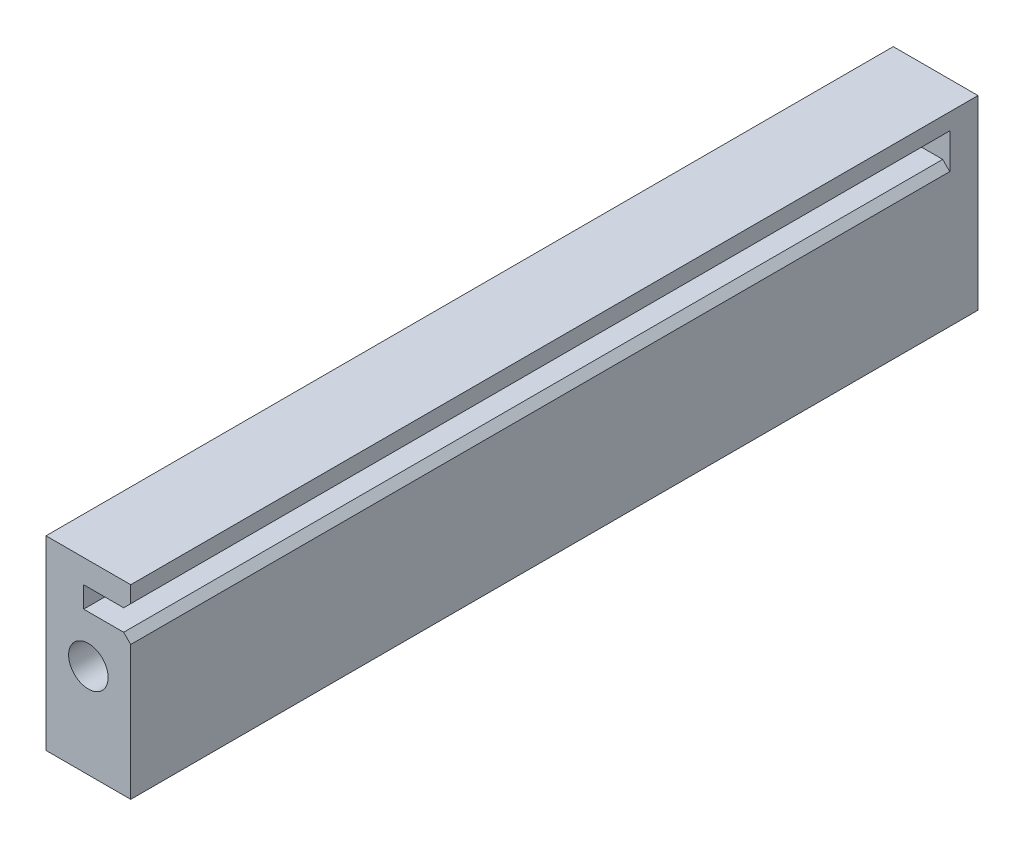
ISO-10303-21;
HEADER;
FILE_DESCRIPTION(('STEP AP214'),'2;1');
FILE_NAME('part.step','',(''),(''),'','','');
FILE_SCHEMA(('AUTOMOTIVE_DESIGN { 1 0 10303 214 1 1 1 1 }'));
ENDSEC;
DATA;
#1=APPLICATION_CONTEXT('core data for automotive mechanical design processes');
#2=APPLICATION_PROTOCOL_DEFINITION('international standard','automotive_design',2000,#1);
#3=PRODUCT_CONTEXT('',#1,'mechanical');
#4=PRODUCT('Part','Part','',(#3));
#5=PRODUCT_RELATED_PRODUCT_CATEGORY('part','',(#4));
#6=PRODUCT_DEFINITION_FORMATION('','',#4);
#7=PRODUCT_DEFINITION_CONTEXT('part definition',#1,'design');
#8=PRODUCT_DEFINITION('design','',#6,#7);
#9=PRODUCT_DEFINITION_SHAPE('','',#8);
#10=(LENGTH_UNIT() NAMED_UNIT(*) SI_UNIT(.MILLI.,.METRE.));
#11=(NAMED_UNIT(*) PLANE_ANGLE_UNIT() SI_UNIT($,.RADIAN.));
#12=(NAMED_UNIT(*) SI_UNIT($,.STERADIAN.) SOLID_ANGLE_UNIT());
#13=UNCERTAINTY_MEASURE_WITH_UNIT(LENGTH_MEASURE(1.E-05),#10,'distance_accuracy_value','');
#14=(GEOMETRIC_REPRESENTATION_CONTEXT(3) GLOBAL_UNCERTAINTY_ASSIGNED_CONTEXT((#13)) GLOBAL_UNIT_ASSIGNED_CONTEXT((#10,
#11,#12)) REPRESENTATION_CONTEXT('',''));
#15=CARTESIAN_POINT('',(0.,0.,0.));
#16=DIRECTION('',(0.,0.,1.));
#17=DIRECTION('',(1.,0.,0.));
#18=AXIS2_PLACEMENT_3D('',#15,#16,#17);
#19=CARTESIAN_POINT('',(0.,7.5,90.));
#20=DIRECTION('',(0.,1.,0.));
#21=DIRECTION('',(0.,0.,1.));
#22=AXIS2_PLACEMENT_3D('',#19,#20,#21);
#23=PLANE('',#22);
#24=DIRECTION('',(1.,0.,0.));
#25=VECTOR('',#24,1.);
#26=CARTESIAN_POINT('',(0.,7.5,90.));
#27=LINE('',#26,#25);
#28=CARTESIAN_POINT('',(-0.499999999999999,7.5,90.));
#29=VERTEX_POINT('',#28);
#30=CARTESIAN_POINT('',(3.75,7.5,90.));
#31=VERTEX_POINT('',#30);
#32=EDGE_CURVE('E171',#29,#31,#27,.T.);
#33=ORIENTED_EDGE('',*,*,#32,.T.);
#34=DIRECTION('',(0.,0.,-1.));
#35=VECTOR('',#34,1.);
#36=CARTESIAN_POINT('',(3.75,7.5,3.));
#37=LINE('',#36,#35);
#38=CARTESIAN_POINT('',(3.75,7.5,3.));
#39=VERTEX_POINT('',#38);
#40=EDGE_CURVE('E121',#31,#39,#37,.T.);
#41=ORIENTED_EDGE('',*,*,#40,.T.);
#42=DIRECTION('',(-1.,0.,0.));
#43=VECTOR('',#42,1.);
#44=CARTESIAN_POINT('',(4.5,7.5,3.));
#45=LINE('',#44,#43);
#46=CARTESIAN_POINT('',(-0.499999999999999,7.5,3.));
#47=VERTEX_POINT('',#46);
#48=EDGE_CURVE('E114',#39,#47,#45,.T.);
#49=ORIENTED_EDGE('',*,*,#48,.T.);
#50=DIRECTION('',(0.,0.,-1.));
#51=VECTOR('',#50,1.);
#52=CARTESIAN_POINT('',(-0.499999999999999,7.5,90.));
#53=LINE('',#52,#51);
#54=EDGE_CURVE('E118',#29,#47,#53,.T.);
#55=ORIENTED_EDGE('',*,*,#54,.F.);
#56=EDGE_LOOP('',(#33,#41,#49,#55));
#57=FACE_BOUND('',#56,.T.);
#58=ADVANCED_FACE('F38',(#57),#23,.T.);
#59=CARTESIAN_POINT('',(-0.499999999999999,0.,90.));
#60=DIRECTION('',(-1.,0.,0.));
#61=DIRECTION('',(0.,0.,1.));
#62=AXIS2_PLACEMENT_3D('',#59,#60,#61);
#63=PLANE('',#62);
#64=DIRECTION('',(0.,1.,0.));
#65=VECTOR('',#64,1.);
#66=CARTESIAN_POINT('',(-0.499999999999999,9.75,3.));
#67=LINE('',#66,#65);
#68=CARTESIAN_POINT('',(-0.499999999999999,9.75,3.));
#69=VERTEX_POINT('',#68);
#70=EDGE_CURVE('E123',#47,#69,#67,.T.);
#71=ORIENTED_EDGE('',*,*,#70,.T.);
#72=DIRECTION('',(0.,0.,-1.));
#73=VECTOR('',#72,1.);
#74=CARTESIAN_POINT('',(-0.499999999999999,9.75,90.));
#75=LINE('',#74,#73);
#76=CARTESIAN_POINT('',(-0.499999999999999,9.75,90.));
#77=VERTEX_POINT('',#76);
#78=EDGE_CURVE('E138',#77,#69,#75,.T.);
#79=ORIENTED_EDGE('',*,*,#78,.F.);
#80=DIRECTION('',(0.,1.,0.));
#81=VECTOR('',#80,1.);
#82=CARTESIAN_POINT('',(-0.499999999999999,0.,90.));
#83=LINE('',#82,#81);
#84=EDGE_CURVE('E135',#29,#77,#83,.T.);
#85=ORIENTED_EDGE('',*,*,#84,.F.);
#86=ORIENTED_EDGE('',*,*,#54,.T.);
#87=EDGE_LOOP('',(#71,#79,#85,#86));
#88=FACE_BOUND('',#87,.T.);
#89=ADVANCED_FACE('F133',(#88),#63,.F.);
#90=CARTESIAN_POINT('',(0.,9.75,90.));
#91=DIRECTION('',(0.,-1.,0.));
#92=DIRECTION('',(1.,0.,0.));
#93=AXIS2_PLACEMENT_3D('',#90,#91,#92);
#94=PLANE('',#93);
#95=DIRECTION('',(1.,0.,0.));
#96=VECTOR('',#95,1.);
#97=CARTESIAN_POINT('',(4.5,9.75,3.));
#98=LINE('',#97,#96);
#99=CARTESIAN_POINT('',(3.74999999999999,9.75,3.));
#100=VERTEX_POINT('',#99);
#101=EDGE_CURVE('E128',#69,#100,#98,.T.);
#102=ORIENTED_EDGE('',*,*,#101,.T.);
#103=DIRECTION('',(0.,0.,1.));
#104=VECTOR('',#103,1.);
#105=CARTESIAN_POINT('',(3.74999999999999,9.75,90.));
#106=LINE('',#105,#104);
#107=CARTESIAN_POINT('',(3.74999999999999,9.75,90.));
#108=VERTEX_POINT('',#107);
#109=EDGE_CURVE('E59',#100,#108,#106,.T.);
#110=ORIENTED_EDGE('',*,*,#109,.T.);
#111=DIRECTION('',(-1.,0.,0.));
#112=VECTOR('',#111,1.);
#113=CARTESIAN_POINT('',(0.,9.75,90.));
#114=LINE('',#113,#112);
#115=EDGE_CURVE('E179',#108,#77,#114,.T.);
#116=ORIENTED_EDGE('',*,*,#115,.T.);
#117=ORIENTED_EDGE('',*,*,#78,.T.);
#118=EDGE_LOOP('',(#102,#110,#116,#117));
#119=FACE_BOUND('',#118,.T.);
#120=ADVANCED_FACE('F233',(#119),#94,.T.);
#121=CARTESIAN_POINT('',(0.,-7.5,90.));
#122=DIRECTION('',(0.,1.,0.));
#123=DIRECTION('',(0.,0.,1.));
#124=AXIS2_PLACEMENT_3D('',#121,#122,#123);
#125=PLANE('',#124);
#126=CARTESIAN_POINT('',(0.,-7.5,22.5));
#127=DIRECTION('',(0.,-1.,0.));
#128=DIRECTION('',(0.,0.,-1.));
#129=AXIS2_PLACEMENT_3D('',#126,#127,#128);
#130=CIRCLE('',#129,2.1);
#131=CARTESIAN_POINT('',(0.,-7.5,20.4));
#132=VERTEX_POINT('',#131);
#133=EDGE_CURVE('E253',#132,#132,#130,.T.);
#134=ORIENTED_EDGE('',*,*,#133,.F.);
#135=EDGE_LOOP('',(#134));
#136=FACE_BOUND('',#135,.T.);
#137=CARTESIAN_POINT('',(0.,-7.5,67.5));
#138=DIRECTION('',(0.,-1.,0.));
#139=DIRECTION('',(0.,0.,-1.));
#140=AXIS2_PLACEMENT_3D('',#137,#138,#139);
#141=CIRCLE('',#140,2.1);
#142=CARTESIAN_POINT('',(0.,-7.5,65.4));
#143=VERTEX_POINT('',#142);
#144=EDGE_CURVE('E257',#143,#143,#141,.T.);
#145=ORIENTED_EDGE('',*,*,#144,.F.);
#146=EDGE_LOOP('',(#145));
#147=FACE_BOUND('',#146,.T.);
#148=CARTESIAN_POINT('',(0.,-7.5,45.));
#149=DIRECTION('',(0.,-1.,0.));
#150=DIRECTION('',(0.,0.,-1.));
#151=AXIS2_PLACEMENT_3D('',#148,#149,#150);
#152=CIRCLE('',#151,2.1);
#153=CARTESIAN_POINT('',(0.,-7.5,42.9));
#154=VERTEX_POINT('',#153);
#155=EDGE_CURVE('E261',#154,#154,#152,.T.);
#156=ORIENTED_EDGE('',*,*,#155,.F.);
#157=EDGE_LOOP('',(#156));
#158=FACE_BOUND('',#157,.T.);
#159=DIRECTION('',(1.,0.,0.));
#160=VECTOR('',#159,1.);
#161=CARTESIAN_POINT('',(0.,-7.5,0.));
#162=LINE('',#161,#160);
#163=CARTESIAN_POINT('',(-4.5,-7.5,0.));
#164=VERTEX_POINT('',#163);
#165=CARTESIAN_POINT('',(4.5,-7.5,0.));
#166=VERTEX_POINT('',#165);
#167=EDGE_CURVE('E190',#164,#166,#162,.T.);
#168=ORIENTED_EDGE('',*,*,#167,.T.);
#169=DIRECTION('',(0.,0.,-1.));
#170=VECTOR('',#169,1.);
#171=CARTESIAN_POINT('',(4.5,-7.5,90.));
#172=LINE('',#171,#170);
#173=CARTESIAN_POINT('',(4.5,-7.5,90.));
#174=VERTEX_POINT('',#173);
#175=EDGE_CURVE('E137',#174,#166,#172,.T.);
#176=ORIENTED_EDGE('',*,*,#175,.F.);
#177=DIRECTION('',(1.,0.,0.));
#178=VECTOR('',#177,1.);
#179=CARTESIAN_POINT('',(0.,-7.5,90.));
#180=LINE('',#179,#178);
#181=CARTESIAN_POINT('',(-4.5,-7.5,90.));
#182=VERTEX_POINT('',#181);
#183=EDGE_CURVE('E169',#182,#174,#180,.T.);
#184=ORIENTED_EDGE('',*,*,#183,.F.);
#185=DIRECTION('',(0.,0.,-1.));
#186=VECTOR('',#185,1.);
#187=CARTESIAN_POINT('',(-4.5,-7.5,90.));
#188=LINE('',#187,#186);
#189=EDGE_CURVE('E189',#182,#164,#188,.T.);
#190=ORIENTED_EDGE('',*,*,#189,.T.);
#191=EDGE_LOOP('',(#168,#176,#184,#190));
#192=FACE_BOUND('',#191,.T.);
#193=ADVANCED_FACE('F237',(#136,#147,#158,#192),#125,.F.);
#194=CARTESIAN_POINT('',(4.5,0.,90.));
#195=DIRECTION('',(-1.,0.,0.));
#196=DIRECTION('',(0.,0.,1.));
#197=AXIS2_PLACEMENT_3D('',#194,#195,#196);
#198=PLANE('',#197);
#199=DIRECTION('',(0.,-1.,0.));
#200=VECTOR('',#199,1.);
#201=CARTESIAN_POINT('',(4.5,9.75,3.));
#202=LINE('',#201,#200);
#203=CARTESIAN_POINT('',(4.5,10.5,3.));
#204=VERTEX_POINT('',#203);
#205=CARTESIAN_POINT('',(4.5,6.74999999999998,3.));
#206=VERTEX_POINT('',#205);
#207=EDGE_CURVE('E124',#204,#206,#202,.T.);
#208=ORIENTED_EDGE('',*,*,#207,.T.);
#209=DIRECTION('',(0.,0.,1.));
#210=VECTOR('',#209,1.);
#211=CARTESIAN_POINT('',(4.5,6.74999999999998,90.));
#212=LINE('',#211,#210);
#213=CARTESIAN_POINT('',(4.5,6.74999999999998,90.));
#214=VERTEX_POINT('',#213);
#215=EDGE_CURVE('E150',#206,#214,#212,.T.);
#216=ORIENTED_EDGE('',*,*,#215,.T.);
#217=DIRECTION('',(0.,1.,0.));
#218=VECTOR('',#217,1.);
#219=CARTESIAN_POINT('',(4.5,0.,90.));
#220=LINE('',#219,#218);
#221=EDGE_CURVE('E163',#174,#214,#220,.T.);
#222=ORIENTED_EDGE('',*,*,#221,.F.);
#223=ORIENTED_EDGE('',*,*,#175,.T.);
#224=DIRECTION('',(0.,1.,0.));
#225=VECTOR('',#224,1.);
#226=CARTESIAN_POINT('',(4.5,0.,0.));
#227=LINE('',#226,#225);
#228=CARTESIAN_POINT('',(4.5,12.25,0.));
#229=VERTEX_POINT('',#228);
#230=EDGE_CURVE('E193',#166,#229,#227,.T.);
#231=ORIENTED_EDGE('',*,*,#230,.T.);
#232=DIRECTION('',(0.,0.,-1.));
#233=VECTOR('',#232,1.);
#234=CARTESIAN_POINT('',(4.5,12.25,90.));
#235=LINE('',#234,#233);
#236=CARTESIAN_POINT('',(4.5,12.25,90.));
#237=VERTEX_POINT('',#236);
#238=EDGE_CURVE('E142',#237,#229,#235,.T.);
#239=ORIENTED_EDGE('',*,*,#238,.F.);
#240=DIRECTION('',(0.,1.,0.));
#241=VECTOR('',#240,1.);
#242=CARTESIAN_POINT('',(4.5,0.,90.));
#243=LINE('',#242,#241);
#244=CARTESIAN_POINT('',(4.5,10.5,90.));
#245=VERTEX_POINT('',#244);
#246=EDGE_CURVE('E181',#245,#237,#243,.T.);
#247=ORIENTED_EDGE('',*,*,#246,.F.);
#248=DIRECTION('',(0.,0.,-1.));
#249=VECTOR('',#248,1.);
#250=CARTESIAN_POINT('',(4.5,10.5,3.));
#251=LINE('',#250,#249);
#252=EDGE_CURVE('E147',#245,#204,#251,.T.);
#253=ORIENTED_EDGE('',*,*,#252,.T.);
#254=EDGE_LOOP('',(#208,#216,#222,#223,#231,#239,#247,#253));
#255=FACE_BOUND('',#254,.T.);
#256=ADVANCED_FACE('F162',(#255),#198,.F.);
#257=CARTESIAN_POINT('',(0.,12.25,90.));
#258=DIRECTION('',(0.,1.,0.));
#259=DIRECTION('',(0.,0.,1.));
#260=AXIS2_PLACEMENT_3D('',#257,#258,#259);
#261=PLANE('',#260);
#262=DIRECTION('',(1.,0.,0.));
#263=VECTOR('',#262,1.);
#264=CARTESIAN_POINT('',(0.,12.25,0.));
#265=LINE('',#264,#263);
#266=CARTESIAN_POINT('',(-4.5,12.25,0.));
#267=VERTEX_POINT('',#266);
#268=EDGE_CURVE('E197',#267,#229,#265,.T.);
#269=ORIENTED_EDGE('',*,*,#268,.F.);
#270=DIRECTION('',(0.,0.,-1.));
#271=VECTOR('',#270,1.);
#272=CARTESIAN_POINT('',(-4.5,12.25,90.));
#273=LINE('',#272,#271);
#274=CARTESIAN_POINT('',(-4.5,12.25,90.));
#275=VERTEX_POINT('',#274);
#276=EDGE_CURVE('E203',#275,#267,#273,.T.);
#277=ORIENTED_EDGE('',*,*,#276,.F.);
#278=DIRECTION('',(1.,0.,0.));
#279=VECTOR('',#278,1.);
#280=CARTESIAN_POINT('',(0.,12.25,90.));
#281=LINE('',#280,#279);
#282=EDGE_CURVE('E183',#275,#237,#281,.T.);
#283=ORIENTED_EDGE('',*,*,#282,.T.);
#284=ORIENTED_EDGE('',*,*,#238,.T.);
#285=EDGE_LOOP('',(#269,#277,#283,#284));
#286=FACE_BOUND('',#285,.T.);
#287=ADVANCED_FACE('F207',(#286),#261,.T.);
#288=CARTESIAN_POINT('',(-4.5,0.,90.));
#289=DIRECTION('',(-1.,0.,0.));
#290=DIRECTION('',(0.,0.,1.));
#291=AXIS2_PLACEMENT_3D('',#288,#289,#290);
#292=PLANE('',#291);
#293=DIRECTION('',(0.,1.,0.));
#294=VECTOR('',#293,1.);
#295=CARTESIAN_POINT('',(-4.5,0.,0.));
#296=LINE('',#295,#294);
#297=EDGE_CURVE('E174',#164,#267,#296,.T.);
#298=ORIENTED_EDGE('',*,*,#297,.F.);
#299=ORIENTED_EDGE('',*,*,#189,.F.);
#300=DIRECTION('',(0.,1.,0.));
#301=VECTOR('',#300,1.);
#302=CARTESIAN_POINT('',(-4.5,0.,90.));
#303=LINE('',#302,#301);
#304=EDGE_CURVE('E186',#182,#275,#303,.T.);
#305=ORIENTED_EDGE('',*,*,#304,.T.);
#306=ORIENTED_EDGE('',*,*,#276,.T.);
#307=EDGE_LOOP('',(#298,#299,#305,#306));
#308=FACE_BOUND('',#307,.T.);
#309=ADVANCED_FACE('F215',(#308),#292,.T.);
#310=CARTESIAN_POINT('',(0.,0.,90.));
#311=DIRECTION('',(0.,0.,1.));
#312=DIRECTION('',(1.,0.,0.));
#313=AXIS2_PLACEMENT_3D('',#310,#311,#312);
#314=PLANE('',#313);
#315=CARTESIAN_POINT('',(0.,2.5,90.));
#316=DIRECTION('',(0.,0.,1.));
#317=DIRECTION('',(1.,0.,0.));
#318=AXIS2_PLACEMENT_3D('',#315,#316,#317);
#319=CIRCLE('',#318,2.1);
#320=CARTESIAN_POINT('',(2.1,2.5,90.));
#321=VERTEX_POINT('',#320);
#322=EDGE_CURVE('E277',#321,#321,#319,.T.);
#323=ORIENTED_EDGE('',*,*,#322,.F.);
#324=EDGE_LOOP('',(#323));
#325=FACE_BOUND('',#324,.T.);
#326=ORIENTED_EDGE('',*,*,#221,.T.);
#327=DIRECTION('',(-0.707106781186541,0.707106781186554,0.));
#328=VECTOR('',#327,1.);
#329=CARTESIAN_POINT('',(5.62500000000004,5.62499999999993,90.));
#330=LINE('',#329,#328);
#331=EDGE_CURVE('E154',#214,#31,#330,.T.);
#332=ORIENTED_EDGE('',*,*,#331,.T.);
#333=ORIENTED_EDGE('',*,*,#32,.F.);
#334=ORIENTED_EDGE('',*,*,#84,.T.);
#335=ORIENTED_EDGE('',*,*,#115,.F.);
#336=DIRECTION('',(0.707106781186548,0.707106781186547,0.));
#337=VECTOR('',#336,1.);
#338=CARTESIAN_POINT('',(-3.00000000000001,3.00000000000002,90.));
#339=LINE('',#338,#337);
#340=EDGE_CURVE('E152',#108,#245,#339,.T.);
#341=ORIENTED_EDGE('',*,*,#340,.T.);
#342=ORIENTED_EDGE('',*,*,#246,.T.);
#343=ORIENTED_EDGE('',*,*,#282,.F.);
#344=ORIENTED_EDGE('',*,*,#304,.F.);
#345=ORIENTED_EDGE('',*,*,#183,.T.);
#346=EDGE_LOOP('',(#326,#332,#333,#334,#335,#341,#342,#343,#344,#345));
#347=FACE_BOUND('',#346,.T.);
#348=ADVANCED_FACE('F166',(#325,#347),#314,.T.);
#349=CARTESIAN_POINT('',(0.,0.,0.));
#350=DIRECTION('',(0.,0.,1.));
#351=DIRECTION('',(1.,0.,0.));
#352=AXIS2_PLACEMENT_3D('',#349,#350,#351);
#353=PLANE('',#352);
#354=ORIENTED_EDGE('',*,*,#230,.F.);
#355=ORIENTED_EDGE('',*,*,#167,.F.);
#356=ORIENTED_EDGE('',*,*,#297,.T.);
#357=ORIENTED_EDGE('',*,*,#268,.T.);
#358=EDGE_LOOP('',(#354,#355,#356,#357));
#359=FACE_BOUND('',#358,.T.);
#360=ADVANCED_FACE('F212',(#359),#353,.F.);
#361=CARTESIAN_POINT('',(0.,-1.5,45.));
#362=DIRECTION('',(0.,-1.,0.));
#363=DIRECTION('',(0.,0.,-1.));
#364=AXIS2_PLACEMENT_3D('',#361,#362,#363);
#365=CYLINDRICAL_SURFACE('',#364,2.1);
#366=CARTESIAN_POINT('',(0.,-1.5,45.));
#367=DIRECTION('',(0.,-1.,0.));
#368=DIRECTION('',(0.,0.,-1.));
#369=AXIS2_PLACEMENT_3D('',#366,#367,#368);
#370=CIRCLE('',#369,2.1);
#371=CARTESIAN_POINT('',(0.,-1.5,42.9));
#372=VERTEX_POINT('',#371);
#373=EDGE_CURVE('E263',#372,#372,#370,.T.);
#374=ORIENTED_EDGE('',*,*,#373,.F.);
#375=EDGE_LOOP('',(#374));
#376=FACE_BOUND('',#375,.T.);
#377=ORIENTED_EDGE('',*,*,#155,.T.);
#378=EDGE_LOOP('',(#377));
#379=FACE_BOUND('',#378,.T.);
#380=ADVANCED_FACE('F292',(#376,#379),#365,.F.);
#381=CARTESIAN_POINT('',(0.,-1.5,45.));
#382=DIRECTION('',(0.,-1.,0.));
#383=DIRECTION('',(0.,0.,-1.));
#384=AXIS2_PLACEMENT_3D('',#381,#382,#383);
#385=PLANE('',#384);
#386=ORIENTED_EDGE('',*,*,#373,.T.);
#387=EDGE_LOOP('',(#386));
#388=FACE_BOUND('',#387,.T.);
#389=ADVANCED_FACE('F325',(#388),#385,.T.);
#390=CARTESIAN_POINT('',(0.,-1.5,67.5));
#391=DIRECTION('',(0.,-1.,0.));
#392=DIRECTION('',(0.,0.,-1.));
#393=AXIS2_PLACEMENT_3D('',#390,#391,#392);
#394=CYLINDRICAL_SURFACE('',#393,2.1);
#395=CARTESIAN_POINT('',(0.,-1.5,67.5));
#396=DIRECTION('',(0.,-1.,0.));
#397=DIRECTION('',(0.,0.,-1.));
#398=AXIS2_PLACEMENT_3D('',#395,#396,#397);
#399=CIRCLE('',#398,2.1);
#400=CARTESIAN_POINT('',(0.,-1.5,65.4));
#401=VERTEX_POINT('',#400);
#402=EDGE_CURVE('E269',#401,#401,#399,.T.);
#403=ORIENTED_EDGE('',*,*,#402,.F.);
#404=EDGE_LOOP('',(#403));
#405=FACE_BOUND('',#404,.T.);
#406=ORIENTED_EDGE('',*,*,#144,.T.);
#407=EDGE_LOOP('',(#406));
#408=FACE_BOUND('',#407,.T.);
#409=ADVANCED_FACE('F332',(#405,#408),#394,.F.);
#410=CARTESIAN_POINT('',(0.,-1.5,67.5));
#411=DIRECTION('',(0.,-1.,0.));
#412=DIRECTION('',(0.,0.,-1.));
#413=AXIS2_PLACEMENT_3D('',#410,#411,#412);
#414=PLANE('',#413);
#415=ORIENTED_EDGE('',*,*,#402,.T.);
#416=EDGE_LOOP('',(#415));
#417=FACE_BOUND('',#416,.T.);
#418=ADVANCED_FACE('F339',(#417),#414,.T.);
#419=CARTESIAN_POINT('',(0.,-1.5,22.5));
#420=DIRECTION('',(0.,-1.,0.));
#421=DIRECTION('',(0.,0.,-1.));
#422=AXIS2_PLACEMENT_3D('',#419,#420,#421);
#423=CYLINDRICAL_SURFACE('',#422,2.1);
#424=CARTESIAN_POINT('',(0.,-1.5,22.5));
#425=DIRECTION('',(0.,-1.,0.));
#426=DIRECTION('',(0.,0.,-1.));
#427=AXIS2_PLACEMENT_3D('',#424,#425,#426);
#428=CIRCLE('',#427,2.1);
#429=CARTESIAN_POINT('',(0.,-1.5,20.4));
#430=VERTEX_POINT('',#429);
#431=EDGE_CURVE('E194',#430,#430,#428,.T.);
#432=ORIENTED_EDGE('',*,*,#431,.F.);
#433=EDGE_LOOP('',(#432));
#434=FACE_BOUND('',#433,.T.);
#435=ORIENTED_EDGE('',*,*,#133,.T.);
#436=EDGE_LOOP('',(#435));
#437=FACE_BOUND('',#436,.T.);
#438=ADVANCED_FACE('F347',(#434,#437),#423,.F.);
#439=CARTESIAN_POINT('',(0.,-1.5,22.5));
#440=DIRECTION('',(0.,-1.,0.));
#441=DIRECTION('',(0.,0.,-1.));
#442=AXIS2_PLACEMENT_3D('',#439,#440,#441);
#443=PLANE('',#442);
#444=ORIENTED_EDGE('',*,*,#431,.T.);
#445=EDGE_LOOP('',(#444));
#446=FACE_BOUND('',#445,.T.);
#447=ADVANCED_FACE('F355',(#446),#443,.T.);
#448=CARTESIAN_POINT('',(0.,0.,3.));
#449=DIRECTION('',(0.,0.,-1.));
#450=DIRECTION('',(-1.,0.,0.));
#451=AXIS2_PLACEMENT_3D('',#448,#449,#450);
#452=PLANE('',#451);
#453=ORIENTED_EDGE('',*,*,#207,.F.);
#454=DIRECTION('',(-0.707106781186548,-0.707106781186547,0.));
#455=VECTOR('',#454,1.);
#456=CARTESIAN_POINT('',(-3.00000000000001,3.00000000000002,3.));
#457=LINE('',#456,#455);
#458=EDGE_CURVE('E11',#204,#100,#457,.T.);
#459=ORIENTED_EDGE('',*,*,#458,.T.);
#460=ORIENTED_EDGE('',*,*,#101,.F.);
#461=ORIENTED_EDGE('',*,*,#70,.F.);
#462=ORIENTED_EDGE('',*,*,#48,.F.);
#463=DIRECTION('',(0.707106781186541,-0.707106781186554,0.));
#464=VECTOR('',#463,1.);
#465=CARTESIAN_POINT('',(5.62500000000004,5.62499999999993,3.));
#466=LINE('',#465,#464);
#467=EDGE_CURVE('E47',#39,#206,#466,.T.);
#468=ORIENTED_EDGE('',*,*,#467,.T.);
#469=EDGE_LOOP('',(#453,#459,#460,#461,#462,#468));
#470=FACE_BOUND('',#469,.T.);
#471=ADVANCED_FACE('F127',(#470),#452,.F.);
#472=CARTESIAN_POINT('',(3.75,7.5,90.));
#473=DIRECTION('',(0.707106781186554,0.707106781186541,0.));
#474=DIRECTION('',(0.,0.,1.));
#475=AXIS2_PLACEMENT_3D('',#472,#473,#474);
#476=PLANE('',#475);
#477=ORIENTED_EDGE('',*,*,#331,.F.);
#478=ORIENTED_EDGE('',*,*,#215,.F.);
#479=ORIENTED_EDGE('',*,*,#467,.F.);
#480=ORIENTED_EDGE('',*,*,#40,.F.);
#481=EDGE_LOOP('',(#477,#478,#479,#480));
#482=FACE_BOUND('',#481,.T.);
#483=ADVANCED_FACE('F159',(#482),#476,.T.);
#484=CARTESIAN_POINT('',(4.5,10.5,90.));
#485=DIRECTION('',(0.707106781186547,-0.707106781186548,0.));
#486=DIRECTION('',(0.,0.,1.));
#487=AXIS2_PLACEMENT_3D('',#484,#485,#486);
#488=PLANE('',#487);
#489=ORIENTED_EDGE('',*,*,#340,.F.);
#490=ORIENTED_EDGE('',*,*,#109,.F.);
#491=ORIENTED_EDGE('',*,*,#458,.F.);
#492=ORIENTED_EDGE('',*,*,#252,.F.);
#493=EDGE_LOOP('',(#489,#490,#491,#492));
#494=FACE_BOUND('',#493,.T.);
#495=ADVANCED_FACE('F41',(#494),#488,.T.);
#496=CARTESIAN_POINT('',(0.,2.5,84.));
#497=DIRECTION('',(0.,0.,1.));
#498=DIRECTION('',(1.,0.,0.));
#499=AXIS2_PLACEMENT_3D('',#496,#497,#498);
#500=CYLINDRICAL_SURFACE('',#499,2.1);
#501=CARTESIAN_POINT('',(0.,2.5,84.));
#502=DIRECTION('',(0.,0.,1.));
#503=DIRECTION('',(1.,0.,0.));
#504=AXIS2_PLACEMENT_3D('',#501,#502,#503);
#505=CIRCLE('',#504,2.1);
#506=CARTESIAN_POINT('',(2.1,2.5,84.));
#507=VERTEX_POINT('',#506);
#508=EDGE_CURVE('E276',#507,#507,#505,.T.);
#509=ORIENTED_EDGE('',*,*,#508,.F.);
#510=EDGE_LOOP('',(#509));
#511=FACE_BOUND('',#510,.T.);
#512=ORIENTED_EDGE('',*,*,#322,.T.);
#513=EDGE_LOOP('',(#512));
#514=FACE_BOUND('',#513,.T.);
#515=ADVANCED_FACE('F220',(#511,#514),#500,.F.);
#516=CARTESIAN_POINT('',(0.,2.5,84.));
#517=DIRECTION('',(0.,0.,1.));
#518=DIRECTION('',(1.,0.,0.));
#519=AXIS2_PLACEMENT_3D('',#516,#517,#518);
#520=PLANE('',#519);
#521=ORIENTED_EDGE('',*,*,#508,.T.);
#522=EDGE_LOOP('',(#521));
#523=FACE_BOUND('',#522,.T.);
#524=ADVANCED_FACE('F225',(#523),#520,.T.);
#525=CLOSED_SHELL('',(#58,#89,#120,#193,#256,#287,#309,#348,#360,#380,#389,#409,#418,#438,#447,
#471,#483,#495,#515,#524));
#526=MANIFOLD_SOLID_BREP('B2',#525);
#527=ADVANCED_BREP_SHAPE_REPRESENTATION('',(#18,#526),#14);
#528=SHAPE_DEFINITION_REPRESENTATION(#9,#527);
ENDSEC;
END-ISO-10303-21;
